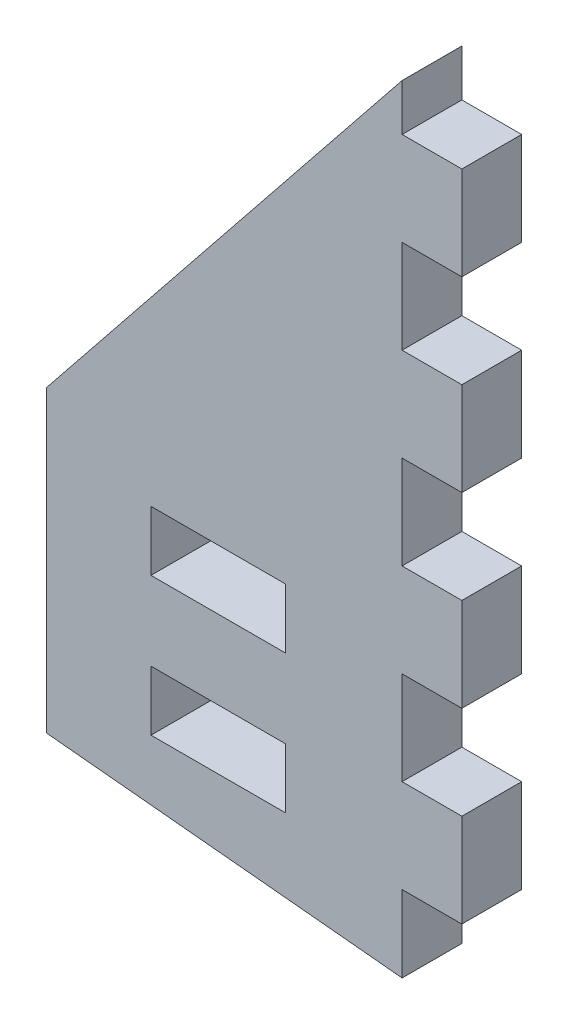
ISO-10303-21;
HEADER;
FILE_DESCRIPTION(('STEP AP214'),'2;1');
FILE_NAME('part.step','',(''),(''),'','','');
FILE_SCHEMA(('AUTOMOTIVE_DESIGN { 1 0 10303 214 1 1 1 1 }'));
ENDSEC;
DATA;
#1=APPLICATION_CONTEXT('core data for automotive mechanical design processes');
#2=APPLICATION_PROTOCOL_DEFINITION('international standard','automotive_design',2000,#1);
#3=PRODUCT_CONTEXT('',#1,'mechanical');
#4=PRODUCT('Part','Part','',(#3));
#5=PRODUCT_RELATED_PRODUCT_CATEGORY('part','',(#4));
#6=PRODUCT_DEFINITION_FORMATION('','',#4);
#7=PRODUCT_DEFINITION_CONTEXT('part definition',#1,'design');
#8=PRODUCT_DEFINITION('design','',#6,#7);
#9=PRODUCT_DEFINITION_SHAPE('','',#8);
#10=(LENGTH_UNIT() NAMED_UNIT(*) SI_UNIT(.MILLI.,.METRE.));
#11=(NAMED_UNIT(*) PLANE_ANGLE_UNIT() SI_UNIT($,.RADIAN.));
#12=(NAMED_UNIT(*) SI_UNIT($,.STERADIAN.) SOLID_ANGLE_UNIT());
#13=UNCERTAINTY_MEASURE_WITH_UNIT(LENGTH_MEASURE(1.E-05),#10,'distance_accuracy_value','');
#14=(GEOMETRIC_REPRESENTATION_CONTEXT(3) GLOBAL_UNCERTAINTY_ASSIGNED_CONTEXT((#13)) GLOBAL_UNIT_ASSIGNED_CONTEXT((#10,
#11,#12)) REPRESENTATION_CONTEXT('',''));
#15=CARTESIAN_POINT('',(0.,0.,0.));
#16=DIRECTION('',(0.,0.,1.));
#17=DIRECTION('',(1.,0.,0.));
#18=AXIS2_PLACEMENT_3D('',#15,#16,#17);
#19=CARTESIAN_POINT('',(0.,0.,4.));
#20=DIRECTION('',(-1.,0.,0.));
#21=DIRECTION('',(0.,0.,1.));
#22=AXIS2_PLACEMENT_3D('',#19,#20,#21);
#23=PLANE('',#22);
#24=DIRECTION('',(0.,1.,0.));
#25=VECTOR('',#24,1.);
#26=CARTESIAN_POINT('',(0.,0.,4.));
#27=LINE('',#26,#25);
#28=CARTESIAN_POINT('',(0.,9.37499999999999,4.));
#29=VERTEX_POINT('',#28);
#30=CARTESIAN_POINT('',(0.,15.625,4.));
#31=VERTEX_POINT('',#30);
#32=EDGE_CURVE('E127',#29,#31,#27,.T.);
#33=ORIENTED_EDGE('',*,*,#32,.F.);
#34=DIRECTION('',(0.,0.,1.));
#35=VECTOR('',#34,1.);
#36=CARTESIAN_POINT('',(0.,9.37499999999999,0.));
#37=LINE('',#36,#35);
#38=CARTESIAN_POINT('',(0.,9.37499999999999,0.));
#39=VERTEX_POINT('',#38);
#40=EDGE_CURVE('E330',#39,#29,#37,.T.);
#41=ORIENTED_EDGE('',*,*,#40,.F.);
#42=DIRECTION('',(0.,1.,0.));
#43=VECTOR('',#42,1.);
#44=CARTESIAN_POINT('',(0.,0.,0.));
#45=LINE('',#44,#43);
#46=CARTESIAN_POINT('',(0.,15.625,0.));
#47=VERTEX_POINT('',#46);
#48=EDGE_CURVE('E428',#39,#47,#45,.T.);
#49=ORIENTED_EDGE('',*,*,#48,.T.);
#50=DIRECTION('',(0.,0.,1.));
#51=VECTOR('',#50,1.);
#52=CARTESIAN_POINT('',(0.,15.625,0.));
#53=LINE('',#52,#51);
#54=EDGE_CURVE('E345',#47,#31,#53,.T.);
#55=ORIENTED_EDGE('',*,*,#54,.T.);
#56=EDGE_LOOP('',(#33,#41,#49,#55));
#57=FACE_BOUND('',#56,.T.);
#58=ADVANCED_FACE('F110',(#57),#23,.F.);
#59=CARTESIAN_POINT('',(0.,21.875,4.));
#60=VERTEX_POINT('',#59);
#61=CARTESIAN_POINT('',(0.,28.125,4.));
#62=VERTEX_POINT('',#61);
#63=EDGE_CURVE('E542',#60,#62,#27,.T.);
#64=ORIENTED_EDGE('',*,*,#63,.F.);
#65=DIRECTION('',(0.,0.,1.));
#66=VECTOR('',#65,1.);
#67=CARTESIAN_POINT('',(0.,21.875,0.));
#68=LINE('',#67,#66);
#69=CARTESIAN_POINT('',(0.,21.875,0.));
#70=VERTEX_POINT('',#69);
#71=EDGE_CURVE('E353',#70,#60,#68,.T.);
#72=ORIENTED_EDGE('',*,*,#71,.F.);
#73=CARTESIAN_POINT('',(0.,28.125,0.));
#74=VERTEX_POINT('',#73);
#75=EDGE_CURVE('E533',#70,#74,#45,.T.);
#76=ORIENTED_EDGE('',*,*,#75,.T.);
#77=DIRECTION('',(0.,0.,1.));
#78=VECTOR('',#77,1.);
#79=CARTESIAN_POINT('',(0.,28.125,0.));
#80=LINE('',#79,#78);
#81=EDGE_CURVE('E372',#74,#62,#80,.T.);
#82=ORIENTED_EDGE('',*,*,#81,.T.);
#83=EDGE_LOOP('',(#64,#72,#76,#82));
#84=FACE_BOUND('',#83,.T.);
#85=ADVANCED_FACE('F562',(#84),#23,.F.);
#86=CARTESIAN_POINT('',(0.,34.375,4.));
#87=VERTEX_POINT('',#86);
#88=CARTESIAN_POINT('',(0.,40.625,4.));
#89=VERTEX_POINT('',#88);
#90=EDGE_CURVE('E543',#87,#89,#27,.T.);
#91=ORIENTED_EDGE('',*,*,#90,.F.);
#92=DIRECTION('',(0.,0.,1.));
#93=VECTOR('',#92,1.);
#94=CARTESIAN_POINT('',(0.,34.375,0.));
#95=LINE('',#94,#93);
#96=CARTESIAN_POINT('',(0.,34.375,0.));
#97=VERTEX_POINT('',#96);
#98=EDGE_CURVE('E380',#97,#87,#95,.T.);
#99=ORIENTED_EDGE('',*,*,#98,.F.);
#100=CARTESIAN_POINT('',(0.,40.625,0.));
#101=VERTEX_POINT('',#100);
#102=EDGE_CURVE('E517',#97,#101,#45,.T.);
#103=ORIENTED_EDGE('',*,*,#102,.T.);
#104=DIRECTION('',(0.,0.,1.));
#105=VECTOR('',#104,1.);
#106=CARTESIAN_POINT('',(0.,40.625,0.));
#107=LINE('',#106,#105);
#108=EDGE_CURVE('E399',#101,#89,#107,.T.);
#109=ORIENTED_EDGE('',*,*,#108,.T.);
#110=EDGE_LOOP('',(#91,#99,#103,#109));
#111=FACE_BOUND('',#110,.T.);
#112=ADVANCED_FACE('F556',(#111),#23,.F.);
#113=DIRECTION('',(0.,0.,1.));
#114=VECTOR('',#113,1.);
#115=CARTESIAN_POINT('',(0.,46.875,0.));
#116=LINE('',#115,#114);
#117=CARTESIAN_POINT('',(0.,46.875,0.));
#118=VERTEX_POINT('',#117);
#119=CARTESIAN_POINT('',(0.,46.875,4.));
#120=VERTEX_POINT('',#119);
#121=EDGE_CURVE('E407',#118,#120,#116,.T.);
#122=ORIENTED_EDGE('',*,*,#121,.F.);
#123=CARTESIAN_POINT('',(0.,50.,0.));
#124=VERTEX_POINT('',#123);
#125=EDGE_CURVE('E426',#118,#124,#45,.T.);
#126=ORIENTED_EDGE('',*,*,#125,.T.);
#127=DIRECTION('',(0.,0.,-1.));
#128=VECTOR('',#127,1.);
#129=CARTESIAN_POINT('',(0.,50.,4.));
#130=LINE('',#129,#128);
#131=CARTESIAN_POINT('',(0.,50.,4.));
#132=VERTEX_POINT('',#131);
#133=EDGE_CURVE('E114',#132,#124,#130,.T.);
#134=ORIENTED_EDGE('',*,*,#133,.F.);
#135=EDGE_CURVE('E419',#120,#132,#27,.T.);
#136=ORIENTED_EDGE('',*,*,#135,.F.);
#137=EDGE_LOOP('',(#122,#126,#134,#136));
#138=FACE_BOUND('',#137,.T.);
#139=ADVANCED_FACE('F514',(#138),#23,.F.);
#140=CARTESIAN_POINT('',(-0.191488989558008,-1.9814947615133,4.));
#141=DIRECTION('',(0.0961905361423311,0.995362939211949,0.));
#142=DIRECTION('',(-0.995362939211949,0.0961905361423311,0.));
#143=AXIS2_PLACEMENT_3D('',#140,#141,#142);
#144=PLANE('',#143);
#145=DIRECTION('',(0.995362939211949,-0.0961905361423311,0.));
#146=VECTOR('',#145,1.);
#147=CARTESIAN_POINT('',(-0.191488989558008,-1.9814947615133,0.));
#148=LINE('',#147,#146);
#149=CARTESIAN_POINT('',(-23.8,0.299999999999996,0.));
#150=VERTEX_POINT('',#149);
#151=CARTESIAN_POINT('',(0.,-2.,0.));
#152=VERTEX_POINT('',#151);
#153=EDGE_CURVE('E423',#150,#152,#148,.T.);
#154=ORIENTED_EDGE('',*,*,#153,.T.);
#155=DIRECTION('',(0.,0.,-1.));
#156=VECTOR('',#155,1.);
#157=CARTESIAN_POINT('',(0.,-2.,4.));
#158=LINE('',#157,#156);
#159=CARTESIAN_POINT('',(0.,-2.,4.));
#160=VERTEX_POINT('',#159);
#161=EDGE_CURVE('E12',#160,#152,#158,.T.);
#162=ORIENTED_EDGE('',*,*,#161,.F.);
#163=DIRECTION('',(0.995362939211949,-0.0961905361423311,0.));
#164=VECTOR('',#163,1.);
#165=CARTESIAN_POINT('',(-0.191488989558008,-1.9814947615133,4.));
#166=LINE('',#165,#164);
#167=CARTESIAN_POINT('',(-23.8,0.299999999999996,4.));
#168=VERTEX_POINT('',#167);
#169=EDGE_CURVE('E416',#168,#160,#166,.T.);
#170=ORIENTED_EDGE('',*,*,#169,.F.);
#171=DIRECTION('',(0.,0.,-1.));
#172=VECTOR('',#171,1.);
#173=CARTESIAN_POINT('',(-23.8,0.299999999999996,4.));
#174=LINE('',#173,#172);
#175=EDGE_CURVE('E119',#168,#150,#174,.T.);
#176=ORIENTED_EDGE('',*,*,#175,.T.);
#177=EDGE_LOOP('',(#154,#162,#170,#176));
#178=FACE_BOUND('',#177,.T.);
#179=ADVANCED_FACE('F525',(#178),#144,.F.);
#180=CARTESIAN_POINT('',(0.,3.12499999999999,0.));
#181=VERTEX_POINT('',#180);
#182=EDGE_CURVE('E420',#152,#181,#45,.T.);
#183=ORIENTED_EDGE('',*,*,#182,.T.);
#184=DIRECTION('',(0.,0.,1.));
#185=VECTOR('',#184,1.);
#186=CARTESIAN_POINT('',(0.,3.12499999999999,0.));
#187=LINE('',#186,#185);
#188=CARTESIAN_POINT('',(0.,3.12499999999999,4.));
#189=VERTEX_POINT('',#188);
#190=EDGE_CURVE('E135',#181,#189,#187,.T.);
#191=ORIENTED_EDGE('',*,*,#190,.T.);
#192=EDGE_CURVE('E421',#160,#189,#27,.T.);
#193=ORIENTED_EDGE('',*,*,#192,.F.);
#194=ORIENTED_EDGE('',*,*,#161,.T.);
#195=EDGE_LOOP('',(#183,#191,#193,#194));
#196=FACE_BOUND('',#195,.T.);
#197=ADVANCED_FACE('F526',(#196),#23,.F.);
#198=CARTESIAN_POINT('',(0.,0.,4.));
#199=DIRECTION('',(0.,0.,1.));
#200=DIRECTION('',(1.,0.,0.));
#201=AXIS2_PLACEMENT_3D('',#198,#199,#200);
#202=PLANE('',#201);
#203=ORIENTED_EDGE('',*,*,#169,.T.);
#204=ORIENTED_EDGE('',*,*,#192,.T.);
#205=DIRECTION('',(1.,0.,0.));
#206=VECTOR('',#205,1.);
#207=CARTESIAN_POINT('',(0.,3.12499999999999,4.));
#208=LINE('',#207,#206);
#209=CARTESIAN_POINT('',(4.,3.12499999999999,4.));
#210=VERTEX_POINT('',#209);
#211=EDGE_CURVE('E327',#189,#210,#208,.T.);
#212=ORIENTED_EDGE('',*,*,#211,.T.);
#213=DIRECTION('',(0.,1.,0.));
#214=VECTOR('',#213,1.);
#215=CARTESIAN_POINT('',(4.,9.37499999999999,4.));
#216=LINE('',#215,#214);
#217=CARTESIAN_POINT('',(4.,9.37499999999999,4.));
#218=VERTEX_POINT('',#217);
#219=EDGE_CURVE('E304',#210,#218,#216,.T.);
#220=ORIENTED_EDGE('',*,*,#219,.T.);
#221=DIRECTION('',(-1.,0.,0.));
#222=VECTOR('',#221,1.);
#223=CARTESIAN_POINT('',(0.,9.37499999999999,4.));
#224=LINE('',#223,#222);
#225=EDGE_CURVE('E321',#218,#29,#224,.T.);
#226=ORIENTED_EDGE('',*,*,#225,.T.);
#227=ORIENTED_EDGE('',*,*,#32,.T.);
#228=DIRECTION('',(1.,0.,0.));
#229=VECTOR('',#228,1.);
#230=CARTESIAN_POINT('',(0.,15.625,4.));
#231=LINE('',#230,#229);
#232=CARTESIAN_POINT('',(4.,15.625,4.));
#233=VERTEX_POINT('',#232);
#234=EDGE_CURVE('E332',#31,#233,#231,.T.);
#235=ORIENTED_EDGE('',*,*,#234,.T.);
#236=DIRECTION('',(0.,1.,0.));
#237=VECTOR('',#236,1.);
#238=CARTESIAN_POINT('',(4.,21.875,4.));
#239=LINE('',#238,#237);
#240=CARTESIAN_POINT('',(4.,21.875,4.));
#241=VERTEX_POINT('',#240);
#242=EDGE_CURVE('E348',#233,#241,#239,.T.);
#243=ORIENTED_EDGE('',*,*,#242,.T.);
#244=DIRECTION('',(-1.,0.,0.));
#245=VECTOR('',#244,1.);
#246=CARTESIAN_POINT('',(0.,21.875,4.));
#247=LINE('',#246,#245);
#248=EDGE_CURVE('E339',#241,#60,#247,.T.);
#249=ORIENTED_EDGE('',*,*,#248,.T.);
#250=ORIENTED_EDGE('',*,*,#63,.T.);
#251=DIRECTION('',(1.,0.,0.));
#252=VECTOR('',#251,1.);
#253=CARTESIAN_POINT('',(0.,28.125,4.));
#254=LINE('',#253,#252);
#255=CARTESIAN_POINT('',(4.,28.125,4.));
#256=VERTEX_POINT('',#255);
#257=EDGE_CURVE('E356',#62,#256,#254,.T.);
#258=ORIENTED_EDGE('',*,*,#257,.T.);
#259=DIRECTION('',(0.,1.,0.));
#260=VECTOR('',#259,1.);
#261=CARTESIAN_POINT('',(4.,34.375,4.));
#262=LINE('',#261,#260);
#263=CARTESIAN_POINT('',(4.,34.375,4.));
#264=VERTEX_POINT('',#263);
#265=EDGE_CURVE('E375',#256,#264,#262,.T.);
#266=ORIENTED_EDGE('',*,*,#265,.T.);
#267=DIRECTION('',(-1.,0.,0.));
#268=VECTOR('',#267,1.);
#269=CARTESIAN_POINT('',(0.,34.375,4.));
#270=LINE('',#269,#268);
#271=EDGE_CURVE('E366',#264,#87,#270,.T.);
#272=ORIENTED_EDGE('',*,*,#271,.T.);
#273=ORIENTED_EDGE('',*,*,#90,.T.);
#274=DIRECTION('',(1.,0.,0.));
#275=VECTOR('',#274,1.);
#276=CARTESIAN_POINT('',(0.,40.625,4.));
#277=LINE('',#276,#275);
#278=CARTESIAN_POINT('',(4.,40.625,4.));
#279=VERTEX_POINT('',#278);
#280=EDGE_CURVE('E383',#89,#279,#277,.T.);
#281=ORIENTED_EDGE('',*,*,#280,.T.);
#282=DIRECTION('',(0.,1.,0.));
#283=VECTOR('',#282,1.);
#284=CARTESIAN_POINT('',(4.,46.875,4.));
#285=LINE('',#284,#283);
#286=CARTESIAN_POINT('',(4.,46.875,4.));
#287=VERTEX_POINT('',#286);
#288=EDGE_CURVE('E402',#279,#287,#285,.T.);
#289=ORIENTED_EDGE('',*,*,#288,.T.);
#290=DIRECTION('',(-1.,0.,0.));
#291=VECTOR('',#290,1.);
#292=CARTESIAN_POINT('',(0.,46.875,4.));
#293=LINE('',#292,#291);
#294=EDGE_CURVE('E394',#287,#120,#293,.T.);
#295=ORIENTED_EDGE('',*,*,#294,.T.);
#296=ORIENTED_EDGE('',*,*,#135,.T.);
#297=DIRECTION('',(-0.625335681291706,-0.780355871191752,0.));
#298=VECTOR('',#297,1.);
#299=CARTESIAN_POINT('',(0.,50.,4.));
#300=LINE('',#299,#298);
#301=CARTESIAN_POINT('',(-23.8,20.3,4.));
#302=VERTEX_POINT('',#301);
#303=EDGE_CURVE('E492',#132,#302,#300,.T.);
#304=ORIENTED_EDGE('',*,*,#303,.T.);
#305=DIRECTION('',(0.,-1.,0.));
#306=VECTOR('',#305,1.);
#307=CARTESIAN_POINT('',(-23.8,20.3,4.));
#308=LINE('',#307,#306);
#309=EDGE_CURVE('E494',#302,#168,#308,.T.);
#310=ORIENTED_EDGE('',*,*,#309,.T.);
#311=EDGE_LOOP('',(#203,#204,#212,#220,#226,#227,#235,#243,#249,#250,#258,#266,#272,#273,#281,
#289,#295,#296,#304,#310));
#312=FACE_BOUND('',#311,.T.);
#313=DIRECTION('',(1.,0.,0.));
#314=VECTOR('',#313,1.);
#315=CARTESIAN_POINT('',(-16.8,3.67,4.));
#316=LINE('',#315,#314);
#317=CARTESIAN_POINT('',(-16.8,3.67,4.));
#318=VERTEX_POINT('',#317);
#319=CARTESIAN_POINT('',(-7.79999999999999,3.67,4.));
#320=VERTEX_POINT('',#319);
#321=EDGE_CURVE('E461',#318,#320,#316,.T.);
#322=ORIENTED_EDGE('',*,*,#321,.F.);
#323=DIRECTION('',(0.,-1.,0.));
#324=VECTOR('',#323,1.);
#325=CARTESIAN_POINT('',(-16.8,7.66999999999999,4.));
#326=LINE('',#325,#324);
#327=CARTESIAN_POINT('',(-16.8,7.66999999999999,4.));
#328=VERTEX_POINT('',#327);
#329=EDGE_CURVE('E470',#328,#318,#326,.T.);
#330=ORIENTED_EDGE('',*,*,#329,.F.);
#331=DIRECTION('',(1.,0.,0.));
#332=VECTOR('',#331,1.);
#333=CARTESIAN_POINT('',(-16.8,7.66999999999999,4.));
#334=LINE('',#333,#332);
#335=CARTESIAN_POINT('',(-7.79999999999999,7.67,4.));
#336=VERTEX_POINT('',#335);
#337=EDGE_CURVE('E467',#328,#336,#334,.T.);
#338=ORIENTED_EDGE('',*,*,#337,.T.);
#339=DIRECTION('',(0.,-1.,0.));
#340=VECTOR('',#339,1.);
#341=CARTESIAN_POINT('',(-7.79999999999999,7.67,4.));
#342=LINE('',#341,#340);
#343=EDGE_CURVE('E463',#336,#320,#342,.T.);
#344=ORIENTED_EDGE('',*,*,#343,.T.);
#345=EDGE_LOOP('',(#322,#330,#338,#344));
#346=FACE_BOUND('',#345,.T.);
#347=DIRECTION('',(1.,0.,0.));
#348=VECTOR('',#347,1.);
#349=CARTESIAN_POINT('',(-16.8,12.93,4.));
#350=LINE('',#349,#348);
#351=CARTESIAN_POINT('',(-16.8,12.93,4.));
#352=VERTEX_POINT('',#351);
#353=CARTESIAN_POINT('',(-7.79999999999999,12.93,4.));
#354=VERTEX_POINT('',#353);
#355=EDGE_CURVE('E430',#352,#354,#350,.T.);
#356=ORIENTED_EDGE('',*,*,#355,.F.);
#357=DIRECTION('',(0.,-1.,0.));
#358=VECTOR('',#357,1.);
#359=CARTESIAN_POINT('',(-16.8,16.93,4.));
#360=LINE('',#359,#358);
#361=CARTESIAN_POINT('',(-16.8,16.93,4.));
#362=VERTEX_POINT('',#361);
#363=EDGE_CURVE('E439',#362,#352,#360,.T.);
#364=ORIENTED_EDGE('',*,*,#363,.F.);
#365=DIRECTION('',(1.,0.,0.));
#366=VECTOR('',#365,1.);
#367=CARTESIAN_POINT('',(-16.8,16.93,4.));
#368=LINE('',#367,#366);
#369=CARTESIAN_POINT('',(-7.79999999999999,16.93,4.));
#370=VERTEX_POINT('',#369);
#371=EDGE_CURVE('E436',#362,#370,#368,.T.);
#372=ORIENTED_EDGE('',*,*,#371,.T.);
#373=DIRECTION('',(0.,-1.,0.));
#374=VECTOR('',#373,1.);
#375=CARTESIAN_POINT('',(-7.79999999999999,16.93,4.));
#376=LINE('',#375,#374);
#377=EDGE_CURVE('E432',#370,#354,#376,.T.);
#378=ORIENTED_EDGE('',*,*,#377,.T.);
#379=EDGE_LOOP('',(#356,#364,#372,#378));
#380=FACE_BOUND('',#379,.T.);
#381=ADVANCED_FACE('F522',(#312,#346,#380),#202,.T.);
#382=CARTESIAN_POINT('',(0.,0.,0.));
#383=DIRECTION('',(0.,0.,1.));
#384=DIRECTION('',(1.,0.,0.));
#385=AXIS2_PLACEMENT_3D('',#382,#383,#384);
#386=PLANE('',#385);
#387=ORIENTED_EDGE('',*,*,#153,.F.);
#388=DIRECTION('',(0.,-1.,0.));
#389=VECTOR('',#388,1.);
#390=CARTESIAN_POINT('',(-23.8,20.3,0.));
#391=LINE('',#390,#389);
#392=CARTESIAN_POINT('',(-23.8,20.3,0.));
#393=VERTEX_POINT('',#392);
#394=EDGE_CURVE('E495',#393,#150,#391,.T.);
#395=ORIENTED_EDGE('',*,*,#394,.F.);
#396=DIRECTION('',(-0.625335681291706,-0.780355871191752,0.));
#397=VECTOR('',#396,1.);
#398=CARTESIAN_POINT('',(0.,50.,0.));
#399=LINE('',#398,#397);
#400=EDGE_CURVE('E491',#124,#393,#399,.T.);
#401=ORIENTED_EDGE('',*,*,#400,.F.);
#402=ORIENTED_EDGE('',*,*,#125,.F.);
#403=DIRECTION('',(-1.,0.,0.));
#404=VECTOR('',#403,1.);
#405=CARTESIAN_POINT('',(0.,46.875,0.));
#406=LINE('',#405,#404);
#407=CARTESIAN_POINT('',(4.,46.875,0.));
#408=VERTEX_POINT('',#407);
#409=EDGE_CURVE('E397',#408,#118,#406,.T.);
#410=ORIENTED_EDGE('',*,*,#409,.F.);
#411=DIRECTION('',(0.,1.,0.));
#412=VECTOR('',#411,1.);
#413=CARTESIAN_POINT('',(4.,46.875,0.));
#414=LINE('',#413,#412);
#415=CARTESIAN_POINT('',(4.,40.625,0.));
#416=VERTEX_POINT('',#415);
#417=EDGE_CURVE('E393',#416,#408,#414,.T.);
#418=ORIENTED_EDGE('',*,*,#417,.F.);
#419=DIRECTION('',(1.,0.,0.));
#420=VECTOR('',#419,1.);
#421=CARTESIAN_POINT('',(0.,40.625,0.));
#422=LINE('',#421,#420);
#423=EDGE_CURVE('E390',#101,#416,#422,.T.);
#424=ORIENTED_EDGE('',*,*,#423,.F.);
#425=ORIENTED_EDGE('',*,*,#102,.F.);
#426=DIRECTION('',(-1.,0.,0.));
#427=VECTOR('',#426,1.);
#428=CARTESIAN_POINT('',(0.,34.375,0.));
#429=LINE('',#428,#427);
#430=CARTESIAN_POINT('',(4.,34.375,0.));
#431=VERTEX_POINT('',#430);
#432=EDGE_CURVE('E369',#431,#97,#429,.T.);
#433=ORIENTED_EDGE('',*,*,#432,.F.);
#434=DIRECTION('',(0.,1.,0.));
#435=VECTOR('',#434,1.);
#436=CARTESIAN_POINT('',(4.,34.375,0.));
#437=LINE('',#436,#435);
#438=CARTESIAN_POINT('',(4.,28.125,0.));
#439=VERTEX_POINT('',#438);
#440=EDGE_CURVE('E365',#439,#431,#437,.T.);
#441=ORIENTED_EDGE('',*,*,#440,.F.);
#442=DIRECTION('',(1.,0.,0.));
#443=VECTOR('',#442,1.);
#444=CARTESIAN_POINT('',(0.,28.125,0.));
#445=LINE('',#444,#443);
#446=EDGE_CURVE('E362',#74,#439,#445,.T.);
#447=ORIENTED_EDGE('',*,*,#446,.F.);
#448=ORIENTED_EDGE('',*,*,#75,.F.);
#449=DIRECTION('',(-1.,0.,0.));
#450=VECTOR('',#449,1.);
#451=CARTESIAN_POINT('',(0.,21.875,0.));
#452=LINE('',#451,#450);
#453=CARTESIAN_POINT('',(4.,21.875,0.));
#454=VERTEX_POINT('',#453);
#455=EDGE_CURVE('E342',#454,#70,#452,.T.);
#456=ORIENTED_EDGE('',*,*,#455,.F.);
#457=DIRECTION('',(0.,1.,0.));
#458=VECTOR('',#457,1.);
#459=CARTESIAN_POINT('',(4.,21.875,0.));
#460=LINE('',#459,#458);
#461=CARTESIAN_POINT('',(4.,15.625,0.));
#462=VERTEX_POINT('',#461);
#463=EDGE_CURVE('E338',#462,#454,#460,.T.);
#464=ORIENTED_EDGE('',*,*,#463,.F.);
#465=DIRECTION('',(1.,0.,0.));
#466=VECTOR('',#465,1.);
#467=CARTESIAN_POINT('',(0.,15.625,0.));
#468=LINE('',#467,#466);
#469=EDGE_CURVE('E335',#47,#462,#468,.T.);
#470=ORIENTED_EDGE('',*,*,#469,.F.);
#471=ORIENTED_EDGE('',*,*,#48,.F.);
#472=DIRECTION('',(-1.,0.,0.));
#473=VECTOR('',#472,1.);
#474=CARTESIAN_POINT('',(0.,9.37499999999999,0.));
#475=LINE('',#474,#473);
#476=CARTESIAN_POINT('',(4.,9.37499999999999,0.));
#477=VERTEX_POINT('',#476);
#478=EDGE_CURVE('E318',#477,#39,#475,.T.);
#479=ORIENTED_EDGE('',*,*,#478,.F.);
#480=DIRECTION('',(0.,1.,0.));
#481=VECTOR('',#480,1.);
#482=CARTESIAN_POINT('',(4.,9.37499999999999,0.));
#483=LINE('',#482,#481);
#484=CARTESIAN_POINT('',(4.,3.12499999999999,0.));
#485=VERTEX_POINT('',#484);
#486=EDGE_CURVE('E301',#485,#477,#483,.T.);
#487=ORIENTED_EDGE('',*,*,#486,.F.);
#488=DIRECTION('',(1.,0.,0.));
#489=VECTOR('',#488,1.);
#490=CARTESIAN_POINT('',(0.,3.12499999999999,0.));
#491=LINE('',#490,#489);
#492=EDGE_CURVE('E316',#181,#485,#491,.T.);
#493=ORIENTED_EDGE('',*,*,#492,.F.);
#494=ORIENTED_EDGE('',*,*,#182,.F.);
#495=EDGE_LOOP('',(#387,#395,#401,#402,#410,#418,#424,#425,#433,#441,#447,#448,#456,#464,#470,
#471,#479,#487,#493,#494));
#496=FACE_BOUND('',#495,.T.);
#497=DIRECTION('',(0.,-1.,0.));
#498=VECTOR('',#497,1.);
#499=CARTESIAN_POINT('',(-16.8,7.66999999999999,0.));
#500=LINE('',#499,#498);
#501=CARTESIAN_POINT('',(-16.8,7.66999999999999,0.));
#502=VERTEX_POINT('',#501);
#503=CARTESIAN_POINT('',(-16.8,3.67,0.));
#504=VERTEX_POINT('',#503);
#505=EDGE_CURVE('E464',#502,#504,#500,.T.);
#506=ORIENTED_EDGE('',*,*,#505,.T.);
#507=DIRECTION('',(1.,0.,0.));
#508=VECTOR('',#507,1.);
#509=CARTESIAN_POINT('',(-16.8,3.67,0.));
#510=LINE('',#509,#508);
#511=CARTESIAN_POINT('',(-7.79999999999999,3.67,0.));
#512=VERTEX_POINT('',#511);
#513=EDGE_CURVE('E460',#504,#512,#510,.T.);
#514=ORIENTED_EDGE('',*,*,#513,.T.);
#515=DIRECTION('',(0.,-1.,0.));
#516=VECTOR('',#515,1.);
#517=CARTESIAN_POINT('',(-7.79999999999999,7.67,0.));
#518=LINE('',#517,#516);
#519=CARTESIAN_POINT('',(-7.79999999999999,7.67,0.));
#520=VERTEX_POINT('',#519);
#521=EDGE_CURVE('E475',#520,#512,#518,.T.);
#522=ORIENTED_EDGE('',*,*,#521,.F.);
#523=DIRECTION('',(1.,0.,0.));
#524=VECTOR('',#523,1.);
#525=CARTESIAN_POINT('',(-16.8,7.66999999999999,0.));
#526=LINE('',#525,#524);
#527=EDGE_CURVE('E478',#502,#520,#526,.T.);
#528=ORIENTED_EDGE('',*,*,#527,.F.);
#529=EDGE_LOOP('',(#506,#514,#522,#528));
#530=FACE_BOUND('',#529,.T.);
#531=DIRECTION('',(0.,-1.,0.));
#532=VECTOR('',#531,1.);
#533=CARTESIAN_POINT('',(-16.8,16.93,0.));
#534=LINE('',#533,#532);
#535=CARTESIAN_POINT('',(-16.8,16.93,0.));
#536=VERTEX_POINT('',#535);
#537=CARTESIAN_POINT('',(-16.8,12.93,0.));
#538=VERTEX_POINT('',#537);
#539=EDGE_CURVE('E433',#536,#538,#534,.T.);
#540=ORIENTED_EDGE('',*,*,#539,.T.);
#541=DIRECTION('',(1.,0.,0.));
#542=VECTOR('',#541,1.);
#543=CARTESIAN_POINT('',(-16.8,12.93,0.));
#544=LINE('',#543,#542);
#545=CARTESIAN_POINT('',(-7.79999999999999,12.93,0.));
#546=VERTEX_POINT('',#545);
#547=EDGE_CURVE('E409',#538,#546,#544,.T.);
#548=ORIENTED_EDGE('',*,*,#547,.T.);
#549=DIRECTION('',(0.,-1.,0.));
#550=VECTOR('',#549,1.);
#551=CARTESIAN_POINT('',(-7.79999999999999,16.93,0.));
#552=LINE('',#551,#550);
#553=CARTESIAN_POINT('',(-7.79999999999999,16.93,0.));
#554=VERTEX_POINT('',#553);
#555=EDGE_CURVE('E444',#554,#546,#552,.T.);
#556=ORIENTED_EDGE('',*,*,#555,.F.);
#557=DIRECTION('',(1.,0.,0.));
#558=VECTOR('',#557,1.);
#559=CARTESIAN_POINT('',(-16.8,16.93,0.));
#560=LINE('',#559,#558);
#561=EDGE_CURVE('E447',#536,#554,#560,.T.);
#562=ORIENTED_EDGE('',*,*,#561,.F.);
#563=EDGE_LOOP('',(#540,#548,#556,#562));
#564=FACE_BOUND('',#563,.T.);
#565=ADVANCED_FACE('F314',(#496,#530,#564),#386,.F.);
#566=CARTESIAN_POINT('',(-7.79999999999999,16.93,4.));
#567=DIRECTION('',(1.,0.,0.));
#568=DIRECTION('',(0.,1.,0.));
#569=AXIS2_PLACEMENT_3D('',#566,#567,#568);
#570=PLANE('',#569);
#571=ORIENTED_EDGE('',*,*,#555,.T.);
#572=DIRECTION('',(0.,0.,-1.));
#573=VECTOR('',#572,1.);
#574=CARTESIAN_POINT('',(-7.79999999999999,12.93,4.));
#575=LINE('',#574,#573);
#576=EDGE_CURVE('E458',#354,#546,#575,.T.);
#577=ORIENTED_EDGE('',*,*,#576,.F.);
#578=ORIENTED_EDGE('',*,*,#377,.F.);
#579=DIRECTION('',(0.,0.,-1.));
#580=VECTOR('',#579,1.);
#581=CARTESIAN_POINT('',(-7.79999999999999,16.93,4.));
#582=LINE('',#581,#580);
#583=EDGE_CURVE('E456',#370,#554,#582,.T.);
#584=ORIENTED_EDGE('',*,*,#583,.T.);
#585=EDGE_LOOP('',(#571,#577,#578,#584));
#586=FACE_BOUND('',#585,.T.);
#587=ADVANCED_FACE('F624',(#586),#570,.F.);
#588=CARTESIAN_POINT('',(-16.8,16.93,4.));
#589=DIRECTION('',(0.,1.,0.));
#590=DIRECTION('',(-1.,0.,0.));
#591=AXIS2_PLACEMENT_3D('',#588,#589,#590);
#592=PLANE('',#591);
#593=ORIENTED_EDGE('',*,*,#561,.T.);
#594=ORIENTED_EDGE('',*,*,#583,.F.);
#595=ORIENTED_EDGE('',*,*,#371,.F.);
#596=DIRECTION('',(0.,0.,-1.));
#597=VECTOR('',#596,1.);
#598=CARTESIAN_POINT('',(-16.8,16.93,4.));
#599=LINE('',#598,#597);
#600=EDGE_CURVE('E454',#362,#536,#599,.T.);
#601=ORIENTED_EDGE('',*,*,#600,.T.);
#602=EDGE_LOOP('',(#593,#594,#595,#601));
#603=FACE_BOUND('',#602,.T.);
#604=ADVANCED_FACE('F634',(#603),#592,.F.);
#605=CARTESIAN_POINT('',(-16.8,16.93,4.));
#606=DIRECTION('',(1.,0.,0.));
#607=DIRECTION('',(0.,0.,-1.));
#608=AXIS2_PLACEMENT_3D('',#605,#606,#607);
#609=PLANE('',#608);
#610=ORIENTED_EDGE('',*,*,#539,.F.);
#611=ORIENTED_EDGE('',*,*,#600,.F.);
#612=ORIENTED_EDGE('',*,*,#363,.T.);
#613=DIRECTION('',(0.,0.,-1.));
#614=VECTOR('',#613,1.);
#615=CARTESIAN_POINT('',(-16.8,12.93,4.));
#616=LINE('',#615,#614);
#617=EDGE_CURVE('E441',#352,#538,#616,.T.);
#618=ORIENTED_EDGE('',*,*,#617,.T.);
#619=EDGE_LOOP('',(#610,#611,#612,#618));
#620=FACE_BOUND('',#619,.T.);
#621=ADVANCED_FACE('F597',(#620),#609,.T.);
#622=CARTESIAN_POINT('',(-16.8,12.93,4.));
#623=DIRECTION('',(0.,1.,0.));
#624=DIRECTION('',(0.,0.,1.));
#625=AXIS2_PLACEMENT_3D('',#622,#623,#624);
#626=PLANE('',#625);
#627=ORIENTED_EDGE('',*,*,#547,.F.);
#628=ORIENTED_EDGE('',*,*,#617,.F.);
#629=ORIENTED_EDGE('',*,*,#355,.T.);
#630=ORIENTED_EDGE('',*,*,#576,.T.);
#631=EDGE_LOOP('',(#627,#628,#629,#630));
#632=FACE_BOUND('',#631,.T.);
#633=ADVANCED_FACE('F614',(#632),#626,.T.);
#634=CARTESIAN_POINT('',(-23.8,20.3,4.));
#635=DIRECTION('',(1.,0.,0.));
#636=DIRECTION('',(0.,1.,0.));
#637=AXIS2_PLACEMENT_3D('',#634,#635,#636);
#638=PLANE('',#637);
#639=ORIENTED_EDGE('',*,*,#394,.T.);
#640=ORIENTED_EDGE('',*,*,#175,.F.);
#641=ORIENTED_EDGE('',*,*,#309,.F.);
#642=DIRECTION('',(0.,0.,-1.));
#643=VECTOR('',#642,1.);
#644=CARTESIAN_POINT('',(-23.8,20.3,4.));
#645=LINE('',#644,#643);
#646=EDGE_CURVE('E498',#302,#393,#645,.T.);
#647=ORIENTED_EDGE('',*,*,#646,.T.);
#648=EDGE_LOOP('',(#639,#640,#641,#647));
#649=FACE_BOUND('',#648,.T.);
#650=ADVANCED_FACE('F518',(#649),#638,.F.);
#651=CARTESIAN_POINT('',(-7.79999999999999,7.67,4.));
#652=DIRECTION('',(1.,0.,0.));
#653=DIRECTION('',(0.,1.,0.));
#654=AXIS2_PLACEMENT_3D('',#651,#652,#653);
#655=PLANE('',#654);
#656=ORIENTED_EDGE('',*,*,#521,.T.);
#657=DIRECTION('',(0.,0.,-1.));
#658=VECTOR('',#657,1.);
#659=CARTESIAN_POINT('',(-7.79999999999999,3.67,4.));
#660=LINE('',#659,#658);
#661=EDGE_CURVE('E489',#320,#512,#660,.T.);
#662=ORIENTED_EDGE('',*,*,#661,.F.);
#663=ORIENTED_EDGE('',*,*,#343,.F.);
#664=DIRECTION('',(0.,0.,-1.));
#665=VECTOR('',#664,1.);
#666=CARTESIAN_POINT('',(-7.79999999999999,7.67,4.));
#667=LINE('',#666,#665);
#668=EDGE_CURVE('E487',#336,#520,#667,.T.);
#669=ORIENTED_EDGE('',*,*,#668,.T.);
#670=EDGE_LOOP('',(#656,#662,#663,#669));
#671=FACE_BOUND('',#670,.T.);
#672=ADVANCED_FACE('F612',(#671),#655,.F.);
#673=CARTESIAN_POINT('',(-16.8,7.66999999999999,4.));
#674=DIRECTION('',(0.,1.,0.));
#675=DIRECTION('',(-1.,0.,0.));
#676=AXIS2_PLACEMENT_3D('',#673,#674,#675);
#677=PLANE('',#676);
#678=ORIENTED_EDGE('',*,*,#527,.T.);
#679=ORIENTED_EDGE('',*,*,#668,.F.);
#680=ORIENTED_EDGE('',*,*,#337,.F.);
#681=DIRECTION('',(0.,0.,-1.));
#682=VECTOR('',#681,1.);
#683=CARTESIAN_POINT('',(-16.8,7.66999999999999,4.));
#684=LINE('',#683,#682);
#685=EDGE_CURVE('E485',#328,#502,#684,.T.);
#686=ORIENTED_EDGE('',*,*,#685,.T.);
#687=EDGE_LOOP('',(#678,#679,#680,#686));
#688=FACE_BOUND('',#687,.T.);
#689=ADVANCED_FACE('F619',(#688),#677,.F.);
#690=CARTESIAN_POINT('',(-16.8,7.66999999999999,4.));
#691=DIRECTION('',(1.,0.,0.));
#692=DIRECTION('',(0.,0.,-1.));
#693=AXIS2_PLACEMENT_3D('',#690,#691,#692);
#694=PLANE('',#693);
#695=ORIENTED_EDGE('',*,*,#505,.F.);
#696=ORIENTED_EDGE('',*,*,#685,.F.);
#697=ORIENTED_EDGE('',*,*,#329,.T.);
#698=DIRECTION('',(0.,0.,-1.));
#699=VECTOR('',#698,1.);
#700=CARTESIAN_POINT('',(-16.8,3.67,4.));
#701=LINE('',#700,#699);
#702=EDGE_CURVE('E472',#318,#504,#701,.T.);
#703=ORIENTED_EDGE('',*,*,#702,.T.);
#704=EDGE_LOOP('',(#695,#696,#697,#703));
#705=FACE_BOUND('',#704,.T.);
#706=ADVANCED_FACE('F609',(#705),#694,.T.);
#707=CARTESIAN_POINT('',(-16.8,3.67,4.));
#708=DIRECTION('',(0.,1.,0.));
#709=DIRECTION('',(-1.,0.,0.));
#710=AXIS2_PLACEMENT_3D('',#707,#708,#709);
#711=PLANE('',#710);
#712=ORIENTED_EDGE('',*,*,#513,.F.);
#713=ORIENTED_EDGE('',*,*,#702,.F.);
#714=ORIENTED_EDGE('',*,*,#321,.T.);
#715=ORIENTED_EDGE('',*,*,#661,.T.);
#716=EDGE_LOOP('',(#712,#713,#714,#715));
#717=FACE_BOUND('',#716,.T.);
#718=ADVANCED_FACE('F603',(#717),#711,.T.);
#719=CARTESIAN_POINT('',(0.,50.,4.));
#720=DIRECTION('',(0.780355871191752,-0.625335681291706,0.));
#721=DIRECTION('',(0.625335681291706,0.780355871191752,0.));
#722=AXIS2_PLACEMENT_3D('',#719,#720,#721);
#723=PLANE('',#722);
#724=ORIENTED_EDGE('',*,*,#400,.T.);
#725=ORIENTED_EDGE('',*,*,#646,.F.);
#726=ORIENTED_EDGE('',*,*,#303,.F.);
#727=ORIENTED_EDGE('',*,*,#133,.T.);
#728=EDGE_LOOP('',(#724,#725,#726,#727));
#729=FACE_BOUND('',#728,.T.);
#730=ADVANCED_FACE('F112',(#729),#723,.F.);
#731=CARTESIAN_POINT('',(0.,46.875,0.));
#732=DIRECTION('',(0.,1.,0.));
#733=DIRECTION('',(0.,0.,1.));
#734=AXIS2_PLACEMENT_3D('',#731,#732,#733);
#735=PLANE('',#734);
#736=ORIENTED_EDGE('',*,*,#294,.F.);
#737=DIRECTION('',(0.,0.,1.));
#738=VECTOR('',#737,1.);
#739=CARTESIAN_POINT('',(4.,46.875,0.));
#740=LINE('',#739,#738);
#741=EDGE_CURVE('E410',#408,#287,#740,.T.);
#742=ORIENTED_EDGE('',*,*,#741,.F.);
#743=ORIENTED_EDGE('',*,*,#409,.T.);
#744=ORIENTED_EDGE('',*,*,#121,.T.);
#745=EDGE_LOOP('',(#736,#742,#743,#744));
#746=FACE_BOUND('',#745,.T.);
#747=ADVANCED_FACE('F548',(#746),#735,.T.);
#748=CARTESIAN_POINT('',(4.,46.875,0.));
#749=DIRECTION('',(1.,0.,0.));
#750=DIRECTION('',(0.,0.,-1.));
#751=AXIS2_PLACEMENT_3D('',#748,#749,#750);
#752=PLANE('',#751);
#753=ORIENTED_EDGE('',*,*,#288,.F.);
#754=DIRECTION('',(0.,0.,1.));
#755=VECTOR('',#754,1.);
#756=CARTESIAN_POINT('',(4.,40.625,0.));
#757=LINE('',#756,#755);
#758=EDGE_CURVE('E412',#416,#279,#757,.T.);
#759=ORIENTED_EDGE('',*,*,#758,.F.);
#760=ORIENTED_EDGE('',*,*,#417,.T.);
#761=ORIENTED_EDGE('',*,*,#741,.T.);
#762=EDGE_LOOP('',(#753,#759,#760,#761));
#763=FACE_BOUND('',#762,.T.);
#764=ADVANCED_FACE('F581',(#763),#752,.T.);
#765=CARTESIAN_POINT('',(0.,40.625,0.));
#766=DIRECTION('',(0.,-1.,0.));
#767=DIRECTION('',(0.,0.,-1.));
#768=AXIS2_PLACEMENT_3D('',#765,#766,#767);
#769=PLANE('',#768);
#770=ORIENTED_EDGE('',*,*,#280,.F.);
#771=ORIENTED_EDGE('',*,*,#108,.F.);
#772=ORIENTED_EDGE('',*,*,#423,.T.);
#773=ORIENTED_EDGE('',*,*,#758,.T.);
#774=EDGE_LOOP('',(#770,#771,#772,#773));
#775=FACE_BOUND('',#774,.T.);
#776=ADVANCED_FACE('F554',(#775),#769,.T.);
#777=CARTESIAN_POINT('',(0.,34.375,0.));
#778=DIRECTION('',(0.,1.,0.));
#779=DIRECTION('',(0.,0.,1.));
#780=AXIS2_PLACEMENT_3D('',#777,#778,#779);
#781=PLANE('',#780);
#782=ORIENTED_EDGE('',*,*,#271,.F.);
#783=DIRECTION('',(0.,0.,1.));
#784=VECTOR('',#783,1.);
#785=CARTESIAN_POINT('',(4.,34.375,0.));
#786=LINE('',#785,#784);
#787=EDGE_CURVE('E384',#431,#264,#786,.T.);
#788=ORIENTED_EDGE('',*,*,#787,.F.);
#789=ORIENTED_EDGE('',*,*,#432,.T.);
#790=ORIENTED_EDGE('',*,*,#98,.T.);
#791=EDGE_LOOP('',(#782,#788,#789,#790));
#792=FACE_BOUND('',#791,.T.);
#793=ADVANCED_FACE('F573',(#792),#781,.T.);
#794=CARTESIAN_POINT('',(4.,34.375,0.));
#795=DIRECTION('',(1.,0.,0.));
#796=DIRECTION('',(0.,0.,-1.));
#797=AXIS2_PLACEMENT_3D('',#794,#795,#796);
#798=PLANE('',#797);
#799=ORIENTED_EDGE('',*,*,#265,.F.);
#800=DIRECTION('',(0.,0.,1.));
#801=VECTOR('',#800,1.);
#802=CARTESIAN_POINT('',(4.,28.125,0.));
#803=LINE('',#802,#801);
#804=EDGE_CURVE('E386',#439,#256,#803,.T.);
#805=ORIENTED_EDGE('',*,*,#804,.F.);
#806=ORIENTED_EDGE('',*,*,#440,.T.);
#807=ORIENTED_EDGE('',*,*,#787,.T.);
#808=EDGE_LOOP('',(#799,#805,#806,#807));
#809=FACE_BOUND('',#808,.T.);
#810=ADVANCED_FACE('F570',(#809),#798,.T.);
#811=CARTESIAN_POINT('',(0.,28.125,0.));
#812=DIRECTION('',(0.,-1.,0.));
#813=DIRECTION('',(0.,0.,-1.));
#814=AXIS2_PLACEMENT_3D('',#811,#812,#813);
#815=PLANE('',#814);
#816=ORIENTED_EDGE('',*,*,#257,.F.);
#817=ORIENTED_EDGE('',*,*,#81,.F.);
#818=ORIENTED_EDGE('',*,*,#446,.T.);
#819=ORIENTED_EDGE('',*,*,#804,.T.);
#820=EDGE_LOOP('',(#816,#817,#818,#819));
#821=FACE_BOUND('',#820,.T.);
#822=ADVANCED_FACE('F566',(#821),#815,.T.);
#823=CARTESIAN_POINT('',(0.,21.875,0.));
#824=DIRECTION('',(0.,1.,0.));
#825=DIRECTION('',(0.,0.,1.));
#826=AXIS2_PLACEMENT_3D('',#823,#824,#825);
#827=PLANE('',#826);
#828=ORIENTED_EDGE('',*,*,#248,.F.);
#829=DIRECTION('',(0.,0.,1.));
#830=VECTOR('',#829,1.);
#831=CARTESIAN_POINT('',(4.,21.875,0.));
#832=LINE('',#831,#830);
#833=EDGE_CURVE('E357',#454,#241,#832,.T.);
#834=ORIENTED_EDGE('',*,*,#833,.F.);
#835=ORIENTED_EDGE('',*,*,#455,.T.);
#836=ORIENTED_EDGE('',*,*,#71,.T.);
#837=EDGE_LOOP('',(#828,#834,#835,#836));
#838=FACE_BOUND('',#837,.T.);
#839=ADVANCED_FACE('F661',(#838),#827,.T.);
#840=CARTESIAN_POINT('',(4.,21.875,0.));
#841=DIRECTION('',(1.,0.,0.));
#842=DIRECTION('',(0.,0.,-1.));
#843=AXIS2_PLACEMENT_3D('',#840,#841,#842);
#844=PLANE('',#843);
#845=ORIENTED_EDGE('',*,*,#242,.F.);
#846=DIRECTION('',(0.,0.,1.));
#847=VECTOR('',#846,1.);
#848=CARTESIAN_POINT('',(4.,15.625,0.));
#849=LINE('',#848,#847);
#850=EDGE_CURVE('E359',#462,#233,#849,.T.);
#851=ORIENTED_EDGE('',*,*,#850,.F.);
#852=ORIENTED_EDGE('',*,*,#463,.T.);
#853=ORIENTED_EDGE('',*,*,#833,.T.);
#854=EDGE_LOOP('',(#845,#851,#852,#853));
#855=FACE_BOUND('',#854,.T.);
#856=ADVANCED_FACE('F540',(#855),#844,.T.);
#857=CARTESIAN_POINT('',(0.,15.625,0.));
#858=DIRECTION('',(0.,-1.,0.));
#859=DIRECTION('',(0.,0.,-1.));
#860=AXIS2_PLACEMENT_3D('',#857,#858,#859);
#861=PLANE('',#860);
#862=ORIENTED_EDGE('',*,*,#234,.F.);
#863=ORIENTED_EDGE('',*,*,#54,.F.);
#864=ORIENTED_EDGE('',*,*,#469,.T.);
#865=ORIENTED_EDGE('',*,*,#850,.T.);
#866=EDGE_LOOP('',(#862,#863,#864,#865));
#867=FACE_BOUND('',#866,.T.);
#868=ADVANCED_FACE('F535',(#867),#861,.T.);
#869=CARTESIAN_POINT('',(0.,9.37499999999999,0.));
#870=DIRECTION('',(0.,1.,0.));
#871=DIRECTION('',(0.,0.,1.));
#872=AXIS2_PLACEMENT_3D('',#869,#870,#871);
#873=PLANE('',#872);
#874=ORIENTED_EDGE('',*,*,#225,.F.);
#875=DIRECTION('',(0.,0.,1.));
#876=VECTOR('',#875,1.);
#877=CARTESIAN_POINT('',(4.,9.37499999999999,0.));
#878=LINE('',#877,#876);
#879=EDGE_CURVE('E309',#477,#218,#878,.T.);
#880=ORIENTED_EDGE('',*,*,#879,.F.);
#881=ORIENTED_EDGE('',*,*,#478,.T.);
#882=ORIENTED_EDGE('',*,*,#40,.T.);
#883=EDGE_LOOP('',(#874,#880,#881,#882));
#884=FACE_BOUND('',#883,.T.);
#885=ADVANCED_FACE('F529',(#884),#873,.T.);
#886=CARTESIAN_POINT('',(4.,9.37499999999999,0.));
#887=DIRECTION('',(1.,0.,0.));
#888=DIRECTION('',(0.,0.,-1.));
#889=AXIS2_PLACEMENT_3D('',#886,#887,#888);
#890=PLANE('',#889);
#891=ORIENTED_EDGE('',*,*,#219,.F.);
#892=DIRECTION('',(0.,0.,1.));
#893=VECTOR('',#892,1.);
#894=CARTESIAN_POINT('',(4.,3.12499999999999,0.));
#895=LINE('',#894,#893);
#896=EDGE_CURVE('E298',#485,#210,#895,.T.);
#897=ORIENTED_EDGE('',*,*,#896,.F.);
#898=ORIENTED_EDGE('',*,*,#486,.T.);
#899=ORIENTED_EDGE('',*,*,#879,.T.);
#900=EDGE_LOOP('',(#891,#897,#898,#899));
#901=FACE_BOUND('',#900,.T.);
#902=ADVANCED_FACE('F300',(#901),#890,.T.);
#903=CARTESIAN_POINT('',(0.,3.12499999999999,0.));
#904=DIRECTION('',(0.,-1.,0.));
#905=DIRECTION('',(0.,0.,-1.));
#906=AXIS2_PLACEMENT_3D('',#903,#904,#905);
#907=PLANE('',#906);
#908=ORIENTED_EDGE('',*,*,#211,.F.);
#909=ORIENTED_EDGE('',*,*,#190,.F.);
#910=ORIENTED_EDGE('',*,*,#492,.T.);
#911=ORIENTED_EDGE('',*,*,#896,.T.);
#912=EDGE_LOOP('',(#908,#909,#910,#911));
#913=FACE_BOUND('',#912,.T.);
#914=ADVANCED_FACE('F320',(#913),#907,.T.);
#915=CLOSED_SHELL('',(#58,#85,#112,#139,#179,#197,#381,#565,#587,#604,#621,#633,#650,#672,#689,
#706,#718,#730,#747,#764,#776,#793,#810,#822,#839,#856,#868,#885,#902,#914));
#916=MANIFOLD_SOLID_BREP('B2',#915);
#917=ADVANCED_BREP_SHAPE_REPRESENTATION('',(#18,#916),#14);
#918=SHAPE_DEFINITION_REPRESENTATION(#9,#917);
ENDSEC;
END-ISO-10303-21;
